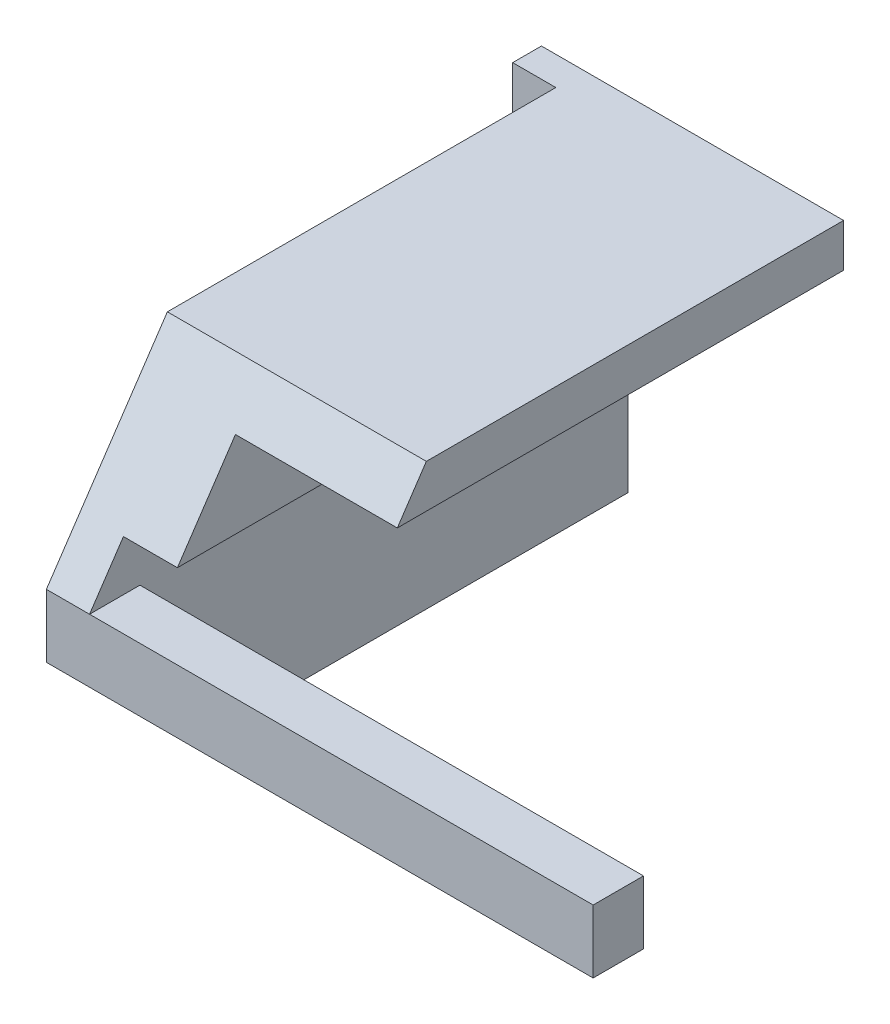
ISO-10303-21;
HEADER;
FILE_DESCRIPTION(('STEP AP214'),'2;1');
FILE_NAME('part.step','',(''),(''),'','','');
FILE_SCHEMA(('AUTOMOTIVE_DESIGN { 1 0 10303 214 1 1 1 1 }'));
ENDSEC;
DATA;
#1=APPLICATION_CONTEXT('core data for automotive mechanical design processes');
#2=APPLICATION_PROTOCOL_DEFINITION('international standard','automotive_design',2000,#1);
#3=PRODUCT_CONTEXT('',#1,'mechanical');
#4=PRODUCT('Part','Part','',(#3));
#5=PRODUCT_RELATED_PRODUCT_CATEGORY('part','',(#4));
#6=PRODUCT_DEFINITION_FORMATION('','',#4);
#7=PRODUCT_DEFINITION_CONTEXT('part definition',#1,'design');
#8=PRODUCT_DEFINITION('design','',#6,#7);
#9=PRODUCT_DEFINITION_SHAPE('','',#8);
#10=(LENGTH_UNIT() NAMED_UNIT(*) SI_UNIT(.MILLI.,.METRE.));
#11=(NAMED_UNIT(*) PLANE_ANGLE_UNIT() SI_UNIT($,.RADIAN.));
#12=(NAMED_UNIT(*) SI_UNIT($,.STERADIAN.) SOLID_ANGLE_UNIT());
#13=UNCERTAINTY_MEASURE_WITH_UNIT(LENGTH_MEASURE(1.E-05),#10,'distance_accuracy_value','');
#14=(GEOMETRIC_REPRESENTATION_CONTEXT(3) GLOBAL_UNCERTAINTY_ASSIGNED_CONTEXT((#13)) GLOBAL_UNIT_ASSIGNED_CONTEXT((#10,
#11,#12)) REPRESENTATION_CONTEXT('',''));
#15=CARTESIAN_POINT('',(0.,0.,0.));
#16=DIRECTION('',(0.,0.,1.));
#17=DIRECTION('',(1.,0.,0.));
#18=AXIS2_PLACEMENT_3D('',#15,#16,#17);
#19=CARTESIAN_POINT('',(3.,0.,0.));
#20=DIRECTION('',(-1.,0.,0.));
#21=DIRECTION('',(0.,0.,1.));
#22=AXIS2_PLACEMENT_3D('',#19,#20,#21);
#23=PLANE('',#22);
#24=DIRECTION('',(0.,0.,1.));
#25=VECTOR('',#24,1.);
#26=CARTESIAN_POINT('',(3.,0.394800000000001,18.2210435524013));
#27=LINE('',#26,#25);
#28=CARTESIAN_POINT('',(3.,0.394799999999999,1.60207145908039));
#29=VERTEX_POINT('',#28);
#30=CARTESIAN_POINT('',(3.,0.394800000000001,20.552934304));
#31=VERTEX_POINT('',#30);
#32=EDGE_CURVE('E177',#29,#31,#27,.T.);
#33=ORIENTED_EDGE('',*,*,#32,.T.);
#34=DIRECTION('',(0.,-0.829790900445012,0.558074422938962));
#35=VECTOR('',#34,1.);
#36=CARTESIAN_POINT('',(3.,9.39479999999999,14.5));
#37=LINE('',#36,#35);
#38=CARTESIAN_POINT('',(3.,-3.1052,22.9068532));
#39=VERTEX_POINT('',#38);
#40=EDGE_CURVE('E179',#31,#39,#37,.T.);
#41=ORIENTED_EDGE('',*,*,#40,.T.);
#42=DIRECTION('',(0.,0.,-1.));
#43=VECTOR('',#42,1.);
#44=CARTESIAN_POINT('',(3.,-3.1052,0.));
#45=LINE('',#44,#43);
#46=CARTESIAN_POINT('',(3.,-3.1052,19.4068532));
#47=VERTEX_POINT('',#46);
#48=EDGE_CURVE('E13',#39,#47,#45,.T.);
#49=ORIENTED_EDGE('',*,*,#48,.T.);
#50=DIRECTION('',(0.,-1.,0.));
#51=VECTOR('',#50,1.);
#52=CARTESIAN_POINT('',(3.,-3.1052,19.4068532));
#53=LINE('',#52,#51);
#54=CARTESIAN_POINT('',(3.,-7.5,19.4068532));
#55=VERTEX_POINT('',#54);
#56=EDGE_CURVE('E220',#47,#55,#53,.T.);
#57=ORIENTED_EDGE('',*,*,#56,.T.);
#58=DIRECTION('',(0.,0.,-1.));
#59=VECTOR('',#58,1.);
#60=CARTESIAN_POINT('',(3.,-7.5,0.));
#61=LINE('',#60,#59);
#62=CARTESIAN_POINT('',(3.,-7.5,22.9068532));
#63=VERTEX_POINT('',#62);
#64=EDGE_CURVE('E214',#63,#55,#61,.T.);
#65=ORIENTED_EDGE('',*,*,#64,.F.);
#66=DIRECTION('',(0.,-0.639876254507868,-0.768477962544783));
#67=VECTOR('',#66,1.);
#68=CARTESIAN_POINT('',(3.,-7.5,22.9068532));
#69=LINE('',#68,#67);
#70=CARTESIAN_POINT('',(3.,-14.5,14.5));
#71=VERTEX_POINT('',#70);
#72=EDGE_CURVE('E57',#63,#71,#69,.T.);
#73=ORIENTED_EDGE('',*,*,#72,.T.);
#74=DIRECTION('',(0.,0.,-1.));
#75=VECTOR('',#74,1.);
#76=CARTESIAN_POINT('',(3.,-14.5,14.5));
#77=LINE('',#76,#75);
#78=CARTESIAN_POINT('',(3.,-14.5,-14.5));
#79=VERTEX_POINT('',#78);
#80=EDGE_CURVE('E265',#71,#79,#77,.T.);
#81=ORIENTED_EDGE('',*,*,#80,.T.);
#82=DIRECTION('',(0.,1.,0.));
#83=VECTOR('',#82,1.);
#84=CARTESIAN_POINT('',(3.,-7.5,-14.5));
#85=LINE('',#84,#83);
#86=CARTESIAN_POINT('',(3.,0.394800000000001,-14.5));
#87=VERTEX_POINT('',#86);
#88=EDGE_CURVE('E267',#79,#87,#85,.T.);
#89=ORIENTED_EDGE('',*,*,#88,.T.);
#90=CARTESIAN_POINT('',(3.,0.394799999999998,-1.60207145908039));
#91=VERTEX_POINT('',#90);
#92=EDGE_CURVE('E187',#87,#91,#27,.T.);
#93=ORIENTED_EDGE('',*,*,#92,.T.);
#94=CARTESIAN_POINT('',(3.,0.,0.));
#95=DIRECTION('',(-1.,0.,0.));
#96=DIRECTION('',(0.,0.,1.));
#97=AXIS2_PLACEMENT_3D('',#94,#95,#96);
#98=CIRCLE('',#97,1.64999999999999);
#99=EDGE_CURVE('E183',#29,#91,#98,.F.);
#100=ORIENTED_EDGE('',*,*,#99,.F.);
#101=EDGE_LOOP('',(#33,#41,#49,#57,#65,#73,#81,#89,#93,#100));
#102=FACE_BOUND('',#101,.T.);
#103=ADVANCED_FACE('F42',(#102),#23,.F.);
#104=CARTESIAN_POINT('',(0.,0.,19.4068532));
#105=DIRECTION('',(0.,0.,-1.));
#106=DIRECTION('',(-1.,0.,0.));
#107=AXIS2_PLACEMENT_3D('',#104,#105,#106);
#108=PLANE('',#107);
#109=DIRECTION('',(1.,0.,0.));
#110=VECTOR('',#109,1.);
#111=CARTESIAN_POINT('',(0.,-7.5,19.4068532));
#112=LINE('',#111,#110);
#113=CARTESIAN_POINT('',(38.,-7.5,19.4068532));
#114=VERTEX_POINT('',#113);
#115=EDGE_CURVE('E50',#55,#114,#112,.T.);
#116=ORIENTED_EDGE('',*,*,#115,.F.);
#117=ORIENTED_EDGE('',*,*,#56,.F.);
#118=DIRECTION('',(-1.,0.,0.));
#119=VECTOR('',#118,1.);
#120=CARTESIAN_POINT('',(0.,-3.1052,19.4068532));
#121=LINE('',#120,#119);
#122=CARTESIAN_POINT('',(38.,-3.1052,19.4068532));
#123=VERTEX_POINT('',#122);
#124=EDGE_CURVE('E65',#123,#47,#121,.T.);
#125=ORIENTED_EDGE('',*,*,#124,.F.);
#126=DIRECTION('',(0.,1.,0.));
#127=VECTOR('',#126,1.);
#128=CARTESIAN_POINT('',(38.,-7.5,19.4068532));
#129=LINE('',#128,#127);
#130=EDGE_CURVE('E269',#114,#123,#129,.T.);
#131=ORIENTED_EDGE('',*,*,#130,.F.);
#132=EDGE_LOOP('',(#116,#117,#125,#131));
#133=FACE_BOUND('',#132,.T.);
#134=ADVANCED_FACE('F333',(#133),#108,.T.);
#135=CARTESIAN_POINT('',(38.,0.,0.));
#136=DIRECTION('',(1.,0.,0.));
#137=DIRECTION('',(0.,0.,-1.));
#138=AXIS2_PLACEMENT_3D('',#135,#136,#137);
#139=PLANE('',#138);
#140=ORIENTED_EDGE('',*,*,#130,.T.);
#141=DIRECTION('',(0.,0.,-1.));
#142=VECTOR('',#141,1.);
#143=CARTESIAN_POINT('',(38.,-3.1052,0.));
#144=LINE('',#143,#142);
#145=CARTESIAN_POINT('',(38.,-3.1052,22.9068532));
#146=VERTEX_POINT('',#145);
#147=EDGE_CURVE('E225',#146,#123,#144,.T.);
#148=ORIENTED_EDGE('',*,*,#147,.F.);
#149=DIRECTION('',(0.,1.,0.));
#150=VECTOR('',#149,1.);
#151=CARTESIAN_POINT('',(38.,-7.5,22.9068532));
#152=LINE('',#151,#150);
#153=CARTESIAN_POINT('',(38.,-7.5,22.9068532));
#154=VERTEX_POINT('',#153);
#155=EDGE_CURVE('E228',#154,#146,#152,.T.);
#156=ORIENTED_EDGE('',*,*,#155,.F.);
#157=DIRECTION('',(0.,0.,-1.));
#158=VECTOR('',#157,1.);
#159=CARTESIAN_POINT('',(38.,-7.5,19.4068532));
#160=LINE('',#159,#158);
#161=EDGE_CURVE('E272',#154,#114,#160,.T.);
#162=ORIENTED_EDGE('',*,*,#161,.T.);
#163=EDGE_LOOP('',(#140,#148,#156,#162));
#164=FACE_BOUND('',#163,.T.);
#165=ADVANCED_FACE('F336',(#164),#139,.T.);
#166=CARTESIAN_POINT('',(0.,0.,22.9068532));
#167=DIRECTION('',(0.,0.,-1.));
#168=DIRECTION('',(-1.,0.,0.));
#169=AXIS2_PLACEMENT_3D('',#166,#167,#168);
#170=PLANE('',#169);
#171=DIRECTION('',(1.,0.,0.));
#172=VECTOR('',#171,1.);
#173=CARTESIAN_POINT('',(0.,-3.1052,22.9068532));
#174=LINE('',#173,#172);
#175=EDGE_CURVE('E223',#39,#146,#174,.T.);
#176=ORIENTED_EDGE('',*,*,#175,.F.);
#177=CARTESIAN_POINT('',(0.,-3.1052,22.9068532));
#178=VERTEX_POINT('',#177);
#179=EDGE_CURVE('E198',#178,#39,#174,.T.);
#180=ORIENTED_EDGE('',*,*,#179,.F.);
#181=DIRECTION('',(0.,-1.,0.));
#182=VECTOR('',#181,1.);
#183=CARTESIAN_POINT('',(0.,0.394800000000002,22.9068532));
#184=LINE('',#183,#182);
#185=CARTESIAN_POINT('',(0.,-7.5,22.9068532));
#186=VERTEX_POINT('',#185);
#187=EDGE_CURVE('E231',#178,#186,#184,.T.);
#188=ORIENTED_EDGE('',*,*,#187,.T.);
#189=DIRECTION('',(1.,0.,0.));
#190=VECTOR('',#189,1.);
#191=CARTESIAN_POINT('',(0.,-7.5,22.9068532));
#192=LINE('',#191,#190);
#193=EDGE_CURVE('E232',#186,#63,#192,.T.);
#194=ORIENTED_EDGE('',*,*,#193,.T.);
#195=EDGE_CURVE('E235',#63,#154,#192,.T.);
#196=ORIENTED_EDGE('',*,*,#195,.T.);
#197=ORIENTED_EDGE('',*,*,#155,.T.);
#198=EDGE_LOOP('',(#176,#180,#188,#194,#196,#197));
#199=FACE_BOUND('',#198,.T.);
#200=ADVANCED_FACE('F339',(#199),#170,.F.);
#201=CARTESIAN_POINT('',(0.,0.,0.));
#202=DIRECTION('',(-1.,0.,0.));
#203=DIRECTION('',(0.,0.,1.));
#204=AXIS2_PLACEMENT_3D('',#201,#202,#203);
#205=PLANE('',#204);
#206=DIRECTION('',(0.,-0.829790900445012,0.558074422938962));
#207=VECTOR('',#206,1.);
#208=CARTESIAN_POINT('',(0.,9.39479999999999,14.5));
#209=LINE('',#208,#207);
#210=CARTESIAN_POINT('',(0.,9.3948,14.5));
#211=VERTEX_POINT('',#210);
#212=EDGE_CURVE('E212',#211,#178,#209,.T.);
#213=ORIENTED_EDGE('',*,*,#212,.F.);
#214=DIRECTION('',(0.,0.,1.));
#215=VECTOR('',#214,1.);
#216=CARTESIAN_POINT('',(0.,9.39479999999999,-12.5));
#217=LINE('',#216,#215);
#218=CARTESIAN_POINT('',(0.,9.39479999999999,-12.5));
#219=VERTEX_POINT('',#218);
#220=EDGE_CURVE('E253',#219,#211,#217,.T.);
#221=ORIENTED_EDGE('',*,*,#220,.F.);
#222=DIRECTION('',(0.,-1.,0.));
#223=VECTOR('',#222,1.);
#224=CARTESIAN_POINT('',(0.,12.5,-12.5));
#225=LINE('',#224,#223);
#226=CARTESIAN_POINT('',(0.,-11.5,-12.5));
#227=VERTEX_POINT('',#226);
#228=EDGE_CURVE('E311',#219,#227,#225,.T.);
#229=ORIENTED_EDGE('',*,*,#228,.T.);
#230=CARTESIAN_POINT('',(0.,-12.5,-12.5));
#231=DIRECTION('',(-1.,0.,0.));
#232=DIRECTION('',(0.,0.,1.));
#233=AXIS2_PLACEMENT_3D('',#230,#231,#232);
#234=CIRCLE('',#233,0.999999999999999);
#235=CARTESIAN_POINT('',(0.,-12.5,-11.5));
#236=VERTEX_POINT('',#235);
#237=EDGE_CURVE('E301',#236,#227,#234,.F.);
#238=ORIENTED_EDGE('',*,*,#237,.F.);
#239=DIRECTION('',(0.,0.,1.));
#240=VECTOR('',#239,1.);
#241=CARTESIAN_POINT('',(0.,-12.5,12.5));
#242=LINE('',#241,#240);
#243=CARTESIAN_POINT('',(0.,-12.5,14.5));
#244=VERTEX_POINT('',#243);
#245=EDGE_CURVE('E313',#236,#244,#242,.T.);
#246=ORIENTED_EDGE('',*,*,#245,.T.);
#247=DIRECTION('',(0.,1.,0.));
#248=VECTOR('',#247,1.);
#249=CARTESIAN_POINT('',(0.,9.39479999999999,14.5));
#250=LINE('',#249,#248);
#251=CARTESIAN_POINT('',(0.,-14.5,14.5));
#252=VERTEX_POINT('',#251);
#253=EDGE_CURVE('E215',#252,#244,#250,.T.);
#254=ORIENTED_EDGE('',*,*,#253,.F.);
#255=DIRECTION('',(0.,-0.639876254507868,-0.768477962544784));
#256=VECTOR('',#255,1.);
#257=CARTESIAN_POINT('',(0.,-7.5,22.9068532));
#258=LINE('',#257,#256);
#259=EDGE_CURVE('E210',#186,#252,#258,.T.);
#260=ORIENTED_EDGE('',*,*,#259,.F.);
#261=ORIENTED_EDGE('',*,*,#187,.F.);
#262=EDGE_LOOP('',(#213,#221,#229,#238,#246,#254,#260,#261));
#263=FACE_BOUND('',#262,.T.);
#264=CARTESIAN_POINT('',(0.,0.,0.));
#265=DIRECTION('',(-1.,0.,0.));
#266=DIRECTION('',(0.,0.,1.));
#267=AXIS2_PLACEMENT_3D('',#264,#265,#266);
#268=CIRCLE('',#267,1.64999999999999);
#269=CARTESIAN_POINT('',(0.,0.,1.64999999999999));
#270=VERTEX_POINT('',#269);
#271=EDGE_CURVE('E289',#270,#270,#268,.T.);
#272=ORIENTED_EDGE('',*,*,#271,.F.);
#273=EDGE_LOOP('',(#272));
#274=FACE_BOUND('',#273,.T.);
#275=ADVANCED_FACE('F431',(#263,#274),#205,.T.);
#276=CARTESIAN_POINT('',(6.75000001549883,0.,0.));
#277=DIRECTION('',(1.,0.,0.));
#278=DIRECTION('',(0.,0.,-1.));
#279=AXIS2_PLACEMENT_3D('',#276,#277,#278);
#280=PLANE('',#279);
#281=DIRECTION('',(0.,0.,1.));
#282=VECTOR('',#281,1.);
#283=CARTESIAN_POINT('',(6.75000001549883,6.3948,-14.5));
#284=LINE('',#283,#282);
#285=CARTESIAN_POINT('',(6.75000001549883,6.3948,-14.5));
#286=VERTEX_POINT('',#285);
#287=CARTESIAN_POINT('',(6.75000001549883,6.3948,16.517644768));
#288=VERTEX_POINT('',#287);
#289=EDGE_CURVE('E263',#286,#288,#284,.T.);
#290=ORIENTED_EDGE('',*,*,#289,.T.);
#291=DIRECTION('',(0.,0.829790900445012,-0.558074422938962));
#292=VECTOR('',#291,1.);
#293=CARTESIAN_POINT('',(6.75000001549883,-7.1351861128365,25.6172133318924));
#294=LINE('',#293,#292);
#295=CARTESIAN_POINT('',(6.75000001549883,0.3948,20.552934304));
#296=VERTEX_POINT('',#295);
#297=EDGE_CURVE('E204',#296,#288,#294,.T.);
#298=ORIENTED_EDGE('',*,*,#297,.F.);
#299=DIRECTION('',(0.,0.,-1.));
#300=VECTOR('',#299,1.);
#301=CARTESIAN_POINT('',(6.75000001549883,0.394800000000001,18.2210435524013));
#302=LINE('',#301,#300);
#303=CARTESIAN_POINT('',(6.75000001549883,0.394799999999996,-14.5));
#304=VERTEX_POINT('',#303);
#305=EDGE_CURVE('E188',#296,#304,#302,.T.);
#306=ORIENTED_EDGE('',*,*,#305,.T.);
#307=DIRECTION('',(0.,1.,0.));
#308=VECTOR('',#307,1.);
#309=CARTESIAN_POINT('',(6.75000001549883,-7.5,-14.5));
#310=LINE('',#309,#308);
#311=EDGE_CURVE('E252',#304,#286,#310,.T.);
#312=ORIENTED_EDGE('',*,*,#311,.T.);
#313=EDGE_LOOP('',(#290,#298,#306,#312));
#314=FACE_BOUND('',#313,.T.);
#315=ADVANCED_FACE('F386',(#314),#280,.T.);
#316=CARTESIAN_POINT('',(0.,0.394799999999999,0.));
#317=DIRECTION('',(0.,-1.,0.));
#318=DIRECTION('',(0.,0.,-1.));
#319=AXIS2_PLACEMENT_3D('',#316,#317,#318);
#320=PLANE('',#319);
#321=ORIENTED_EDGE('',*,*,#305,.F.);
#322=DIRECTION('',(1.,0.,0.));
#323=VECTOR('',#322,1.);
#324=CARTESIAN_POINT('',(3.,0.394800000000001,20.552934304));
#325=LINE('',#324,#323);
#326=EDGE_CURVE('E196',#31,#296,#325,.T.);
#327=ORIENTED_EDGE('',*,*,#326,.F.);
#328=ORIENTED_EDGE('',*,*,#32,.F.);
#329=DIRECTION('',(-1.,0.,0.));
#330=VECTOR('',#329,1.);
#331=CARTESIAN_POINT('',(0.,0.394799999999999,1.60207145908039));
#332=LINE('',#331,#330);
#333=CARTESIAN_POINT('',(5.,0.394799999999999,1.60207145908039));
#334=VERTEX_POINT('',#333);
#335=EDGE_CURVE('E246',#29,#334,#332,.F.);
#336=ORIENTED_EDGE('',*,*,#335,.T.);
#337=DIRECTION('',(0.,0.,-1.));
#338=VECTOR('',#337,1.);
#339=CARTESIAN_POINT('',(5.,0.394799999999999,0.));
#340=LINE('',#339,#338);
#341=CARTESIAN_POINT('',(5.,0.394799999999999,-1.60207145908039));
#342=VERTEX_POINT('',#341);
#343=EDGE_CURVE('E242',#334,#342,#340,.T.);
#344=ORIENTED_EDGE('',*,*,#343,.T.);
#345=DIRECTION('',(-1.,0.,0.));
#346=VECTOR('',#345,1.);
#347=CARTESIAN_POINT('',(0.,0.394799999999999,-1.60207145908039));
#348=LINE('',#347,#346);
#349=EDGE_CURVE('E244',#342,#91,#348,.T.);
#350=ORIENTED_EDGE('',*,*,#349,.T.);
#351=ORIENTED_EDGE('',*,*,#92,.F.);
#352=DIRECTION('',(-1.,0.,0.));
#353=VECTOR('',#352,1.);
#354=CARTESIAN_POINT('',(3.,0.394800000000001,-14.5));
#355=LINE('',#354,#353);
#356=EDGE_CURVE('E239',#304,#87,#355,.T.);
#357=ORIENTED_EDGE('',*,*,#356,.F.);
#358=EDGE_LOOP('',(#321,#327,#328,#336,#344,#350,#351,#357));
#359=FACE_BOUND('',#358,.T.);
#360=ADVANCED_FACE('F201',(#359),#320,.T.);
#361=CARTESIAN_POINT('',(-3.,14.5,14.5));
#362=DIRECTION('',(0.,0.,1.));
#363=DIRECTION('',(0.,-1.,0.));
#364=AXIS2_PLACEMENT_3D('',#361,#362,#363);
#365=PLANE('',#364);
#366=ORIENTED_EDGE('',*,*,#253,.T.);
#367=DIRECTION('',(-1.,0.,0.));
#368=VECTOR('',#367,1.);
#369=CARTESIAN_POINT('',(5.,-12.5,14.5));
#370=LINE('',#369,#368);
#371=CARTESIAN_POINT('',(-3.,-12.5,14.5));
#372=VERTEX_POINT('',#371);
#373=EDGE_CURVE('E295',#244,#372,#370,.T.);
#374=ORIENTED_EDGE('',*,*,#373,.T.);
#375=DIRECTION('',(0.,-1.,0.));
#376=VECTOR('',#375,1.);
#377=CARTESIAN_POINT('',(-3.,14.5,14.5));
#378=LINE('',#377,#376);
#379=CARTESIAN_POINT('',(-3.,-14.5,14.5));
#380=VERTEX_POINT('',#379);
#381=EDGE_CURVE('E323',#372,#380,#378,.T.);
#382=ORIENTED_EDGE('',*,*,#381,.T.);
#383=DIRECTION('',(-1.,0.,0.));
#384=VECTOR('',#383,1.);
#385=CARTESIAN_POINT('',(10.,-14.5,14.5));
#386=LINE('',#385,#384);
#387=EDGE_CURVE('E286',#252,#380,#386,.T.);
#388=ORIENTED_EDGE('',*,*,#387,.F.);
#389=EDGE_LOOP('',(#366,#374,#382,#388));
#390=FACE_BOUND('',#389,.T.);
#391=ADVANCED_FACE('F345',(#390),#365,.T.);
#392=CARTESIAN_POINT('',(0.,6.3948,0.));
#393=DIRECTION('',(0.,-1.,0.));
#394=DIRECTION('',(0.,0.,-1.));
#395=AXIS2_PLACEMENT_3D('',#392,#393,#394);
#396=PLANE('',#395);
#397=DIRECTION('',(0.,0.,-1.));
#398=VECTOR('',#397,1.);
#399=CARTESIAN_POINT('',(18.,6.3948,17.5));
#400=LINE('',#399,#398);
#401=CARTESIAN_POINT('',(18.,6.3948,16.517644768));
#402=VERTEX_POINT('',#401);
#403=CARTESIAN_POINT('',(18.,6.3948,-14.5));
#404=VERTEX_POINT('',#403);
#405=EDGE_CURVE('E274',#402,#404,#400,.T.);
#406=ORIENTED_EDGE('',*,*,#405,.F.);
#407=DIRECTION('',(1.,0.,0.));
#408=VECTOR('',#407,1.);
#409=CARTESIAN_POINT('',(6.75000001549883,6.3948,16.517644768));
#410=LINE('',#409,#408);
#411=EDGE_CURVE('E206',#288,#402,#410,.T.);
#412=ORIENTED_EDGE('',*,*,#411,.F.);
#413=ORIENTED_EDGE('',*,*,#289,.F.);
#414=DIRECTION('',(1.,0.,0.));
#415=VECTOR('',#414,1.);
#416=CARTESIAN_POINT('',(33.,6.3948,-14.5));
#417=LINE('',#416,#415);
#418=EDGE_CURVE('E279',#286,#404,#417,.T.);
#419=ORIENTED_EDGE('',*,*,#418,.T.);
#420=EDGE_LOOP('',(#406,#412,#413,#419));
#421=FACE_BOUND('',#420,.T.);
#422=ADVANCED_FACE('F396',(#421),#396,.T.);
#423=CARTESIAN_POINT('',(18.,0.,0.));
#424=DIRECTION('',(1.,0.,0.));
#425=DIRECTION('',(0.,0.,-1.));
#426=AXIS2_PLACEMENT_3D('',#423,#424,#425);
#427=PLANE('',#426);
#428=DIRECTION('',(0.,0.,-1.));
#429=VECTOR('',#428,1.);
#430=CARTESIAN_POINT('',(18.,9.39479999999999,19.4068532));
#431=LINE('',#430,#429);
#432=CARTESIAN_POINT('',(18.,9.39479999999999,14.5));
#433=VERTEX_POINT('',#432);
#434=CARTESIAN_POINT('',(18.,9.39479999999999,-14.5));
#435=VERTEX_POINT('',#434);
#436=EDGE_CURVE('E249',#433,#435,#431,.T.);
#437=ORIENTED_EDGE('',*,*,#436,.F.);
#438=DIRECTION('',(0.,0.829790900445012,-0.558074422938962));
#439=VECTOR('',#438,1.);
#440=CARTESIAN_POINT('',(18.,-3.00386848206844,22.8387028643373));
#441=LINE('',#440,#439);
#442=EDGE_CURVE('E199',#402,#433,#441,.T.);
#443=ORIENTED_EDGE('',*,*,#442,.F.);
#444=ORIENTED_EDGE('',*,*,#405,.T.);
#445=DIRECTION('',(0.,1.,0.));
#446=VECTOR('',#445,1.);
#447=CARTESIAN_POINT('',(18.,6.3948,-14.5));
#448=LINE('',#447,#446);
#449=EDGE_CURVE('E276',#404,#435,#448,.T.);
#450=ORIENTED_EDGE('',*,*,#449,.T.);
#451=EDGE_LOOP('',(#437,#443,#444,#450));
#452=FACE_BOUND('',#451,.T.);
#453=ADVANCED_FACE('F394',(#452),#427,.T.);
#454=CARTESIAN_POINT('',(0.,9.3948,0.));
#455=DIRECTION('',(0.,-1.,0.));
#456=DIRECTION('',(0.,0.,-1.));
#457=AXIS2_PLACEMENT_3D('',#454,#455,#456);
#458=PLANE('',#457);
#459=DIRECTION('',(1.,0.,0.));
#460=VECTOR('',#459,1.);
#461=CARTESIAN_POINT('',(0.,9.39479999999999,14.5));
#462=LINE('',#461,#460);
#463=EDGE_CURVE('E250',#211,#433,#462,.T.);
#464=ORIENTED_EDGE('',*,*,#463,.T.);
#465=ORIENTED_EDGE('',*,*,#436,.T.);
#466=DIRECTION('',(-1.,0.,0.));
#467=VECTOR('',#466,1.);
#468=CARTESIAN_POINT('',(18.,9.39479999999999,-14.5));
#469=LINE('',#468,#467);
#470=CARTESIAN_POINT('',(-3.,9.39479999999999,-14.5));
#471=VERTEX_POINT('',#470);
#472=EDGE_CURVE('E259',#435,#471,#469,.T.);
#473=ORIENTED_EDGE('',*,*,#472,.T.);
#474=DIRECTION('',(0.,0.,1.));
#475=VECTOR('',#474,1.);
#476=CARTESIAN_POINT('',(-3.,9.39479999999999,-14.5));
#477=LINE('',#476,#475);
#478=CARTESIAN_POINT('',(-3.,9.39479999999999,-12.5));
#479=VERTEX_POINT('',#478);
#480=EDGE_CURVE('E257',#471,#479,#477,.T.);
#481=ORIENTED_EDGE('',*,*,#480,.T.);
#482=DIRECTION('',(1.,0.,0.));
#483=VECTOR('',#482,1.);
#484=CARTESIAN_POINT('',(-3.,9.39479999999999,-12.5));
#485=LINE('',#484,#483);
#486=EDGE_CURVE('E255',#479,#219,#485,.T.);
#487=ORIENTED_EDGE('',*,*,#486,.T.);
#488=ORIENTED_EDGE('',*,*,#220,.T.);
#489=EDGE_LOOP('',(#464,#465,#473,#481,#487,#488));
#490=FACE_BOUND('',#489,.T.);
#491=ADVANCED_FACE('F371',(#490),#458,.F.);
#492=CARTESIAN_POINT('',(0.,0.,0.));
#493=DIRECTION('',(-1.,0.,0.));
#494=DIRECTION('',(0.,0.,1.));
#495=AXIS2_PLACEMENT_3D('',#492,#493,#494);
#496=CYLINDRICAL_SURFACE('',#495,1.64999999999999);
#497=ORIENTED_EDGE('',*,*,#271,.T.);
#498=EDGE_LOOP('',(#497));
#499=FACE_BOUND('',#498,.T.);
#500=ORIENTED_EDGE('',*,*,#335,.F.);
#501=ORIENTED_EDGE('',*,*,#99,.T.);
#502=ORIENTED_EDGE('',*,*,#349,.F.);
#503=CARTESIAN_POINT('',(5.,0.,0.));
#504=DIRECTION('',(1.,0.,0.));
#505=DIRECTION('',(0.,0.,-1.));
#506=AXIS2_PLACEMENT_3D('',#503,#504,#505);
#507=CIRCLE('',#506,1.64999999999999);
#508=EDGE_CURVE('E282',#342,#334,#507,.T.);
#509=ORIENTED_EDGE('',*,*,#508,.T.);
#510=EDGE_LOOP('',(#500,#501,#502,#509));
#511=FACE_BOUND('',#510,.T.);
#512=ADVANCED_FACE('F359',(#499,#511),#496,.F.);
#513=CARTESIAN_POINT('',(5.,0.,0.));
#514=DIRECTION('',(1.,0.,0.));
#515=DIRECTION('',(0.,0.,-1.));
#516=AXIS2_PLACEMENT_3D('',#513,#514,#515);
#517=PLANE('',#516);
#518=ORIENTED_EDGE('',*,*,#343,.F.);
#519=ORIENTED_EDGE('',*,*,#508,.F.);
#520=EDGE_LOOP('',(#518,#519));
#521=FACE_BOUND('',#520,.T.);
#522=ADVANCED_FACE('F363',(#521),#517,.F.);
#523=CARTESIAN_POINT('',(-3.,-14.5,-14.5));
#524=DIRECTION('',(0.,0.,-1.));
#525=DIRECTION('',(0.,1.,0.));
#526=AXIS2_PLACEMENT_3D('',#523,#524,#525);
#527=PLANE('',#526);
#528=ORIENTED_EDGE('',*,*,#356,.T.);
#529=ORIENTED_EDGE('',*,*,#88,.F.);
#530=DIRECTION('',(-1.,0.,0.));
#531=VECTOR('',#530,1.);
#532=CARTESIAN_POINT('',(10.,-14.5,-14.5));
#533=LINE('',#532,#531);
#534=CARTESIAN_POINT('',(-3.,-14.5,-14.5));
#535=VERTEX_POINT('',#534);
#536=EDGE_CURVE('E287',#79,#535,#533,.T.);
#537=ORIENTED_EDGE('',*,*,#536,.T.);
#538=DIRECTION('',(0.,1.,0.));
#539=VECTOR('',#538,1.);
#540=CARTESIAN_POINT('',(-3.,-14.5,-14.5));
#541=LINE('',#540,#539);
#542=EDGE_CURVE('E317',#535,#471,#541,.T.);
#543=ORIENTED_EDGE('',*,*,#542,.T.);
#544=ORIENTED_EDGE('',*,*,#472,.F.);
#545=ORIENTED_EDGE('',*,*,#449,.F.);
#546=ORIENTED_EDGE('',*,*,#418,.F.);
#547=ORIENTED_EDGE('',*,*,#311,.F.);
#548=EDGE_LOOP('',(#528,#529,#537,#543,#544,#545,#546,#547));
#549=FACE_BOUND('',#548,.T.);
#550=ADVANCED_FACE('F44',(#549),#527,.T.);
#551=CARTESIAN_POINT('',(10.,-14.5,14.5));
#552=DIRECTION('',(0.,1.,0.));
#553=DIRECTION('',(0.,0.,1.));
#554=AXIS2_PLACEMENT_3D('',#551,#552,#553);
#555=PLANE('',#554);
#556=ORIENTED_EDGE('',*,*,#536,.F.);
#557=ORIENTED_EDGE('',*,*,#80,.F.);
#558=EDGE_CURVE('E290',#71,#252,#386,.T.);
#559=ORIENTED_EDGE('',*,*,#558,.T.);
#560=ORIENTED_EDGE('',*,*,#387,.T.);
#561=DIRECTION('',(0.,0.,-1.));
#562=VECTOR('',#561,1.);
#563=CARTESIAN_POINT('',(-3.,-14.5,14.5));
#564=LINE('',#563,#562);
#565=EDGE_CURVE('E283',#380,#535,#564,.T.);
#566=ORIENTED_EDGE('',*,*,#565,.T.);
#567=EDGE_LOOP('',(#556,#557,#559,#560,#566));
#568=FACE_BOUND('',#567,.T.);
#569=ADVANCED_FACE('F351',(#568),#555,.F.);
#570=CARTESIAN_POINT('',(0.,-12.5,12.5));
#571=DIRECTION('',(0.,-1.,0.));
#572=DIRECTION('',(0.,0.,-1.));
#573=AXIS2_PLACEMENT_3D('',#570,#571,#572);
#574=PLANE('',#573);
#575=ORIENTED_EDGE('',*,*,#373,.F.);
#576=ORIENTED_EDGE('',*,*,#245,.F.);
#577=DIRECTION('',(-1.,0.,0.));
#578=VECTOR('',#577,1.);
#579=CARTESIAN_POINT('',(2.82842712474619,-12.5,-11.5));
#580=LINE('',#579,#578);
#581=CARTESIAN_POINT('',(-3.,-12.5,-11.5));
#582=VERTEX_POINT('',#581);
#583=EDGE_CURVE('E307',#236,#582,#580,.T.);
#584=ORIENTED_EDGE('',*,*,#583,.T.);
#585=DIRECTION('',(0.,0.,1.));
#586=VECTOR('',#585,1.);
#587=CARTESIAN_POINT('',(-3.,-12.5,12.5));
#588=LINE('',#587,#586);
#589=EDGE_CURVE('E314',#582,#372,#588,.T.);
#590=ORIENTED_EDGE('',*,*,#589,.T.);
#591=EDGE_LOOP('',(#575,#576,#584,#590));
#592=FACE_BOUND('',#591,.T.);
#593=ADVANCED_FACE('F436',(#592),#574,.F.);
#594=CARTESIAN_POINT('',(-3.,0.,0.));
#595=DIRECTION('',(1.,0.,0.));
#596=DIRECTION('',(0.,0.,-1.));
#597=AXIS2_PLACEMENT_3D('',#594,#595,#596);
#598=PLANE('',#597);
#599=DIRECTION('',(0.,-1.,0.));
#600=VECTOR('',#599,1.);
#601=CARTESIAN_POINT('',(-3.,12.5,-12.5));
#602=LINE('',#601,#600);
#603=CARTESIAN_POINT('',(-3.,-11.5,-12.5));
#604=VERTEX_POINT('',#603);
#605=EDGE_CURVE('E310',#479,#604,#602,.T.);
#606=ORIENTED_EDGE('',*,*,#605,.F.);
#607=ORIENTED_EDGE('',*,*,#480,.F.);
#608=ORIENTED_EDGE('',*,*,#542,.F.);
#609=ORIENTED_EDGE('',*,*,#565,.F.);
#610=ORIENTED_EDGE('',*,*,#381,.F.);
#611=ORIENTED_EDGE('',*,*,#589,.F.);
#612=CARTESIAN_POINT('',(-3.,-12.5,-12.5));
#613=DIRECTION('',(-1.,0.,0.));
#614=DIRECTION('',(0.,0.,1.));
#615=AXIS2_PLACEMENT_3D('',#612,#613,#614);
#616=CIRCLE('',#615,0.999999999999999);
#617=EDGE_CURVE('E299',#604,#582,#616,.T.);
#618=ORIENTED_EDGE('',*,*,#617,.F.);
#619=EDGE_LOOP('',(#606,#607,#608,#609,#610,#611,#618));
#620=FACE_BOUND('',#619,.T.);
#621=ADVANCED_FACE('F420',(#620),#598,.F.);
#622=CARTESIAN_POINT('',(0.,12.5,-12.5));
#623=DIRECTION('',(0.,0.,-1.));
#624=DIRECTION('',(0.,1.,0.));
#625=AXIS2_PLACEMENT_3D('',#622,#623,#624);
#626=PLANE('',#625);
#627=ORIENTED_EDGE('',*,*,#228,.F.);
#628=ORIENTED_EDGE('',*,*,#486,.F.);
#629=ORIENTED_EDGE('',*,*,#605,.T.);
#630=DIRECTION('',(-1.,0.,0.));
#631=VECTOR('',#630,1.);
#632=CARTESIAN_POINT('',(2.82842712474619,-11.5,-12.5));
#633=LINE('',#632,#631);
#634=EDGE_CURVE('E304',#604,#227,#633,.F.);
#635=ORIENTED_EDGE('',*,*,#634,.T.);
#636=EDGE_LOOP('',(#627,#628,#629,#635));
#637=FACE_BOUND('',#636,.T.);
#638=ADVANCED_FACE('F426',(#637),#626,.F.);
#639=CARTESIAN_POINT('',(2.82842712474619,-12.5,-12.5));
#640=DIRECTION('',(-1.,0.,0.));
#641=DIRECTION('',(0.,0.,1.));
#642=AXIS2_PLACEMENT_3D('',#639,#640,#641);
#643=CYLINDRICAL_SURFACE('',#642,0.999999999999999);
#644=ORIENTED_EDGE('',*,*,#237,.T.);
#645=ORIENTED_EDGE('',*,*,#634,.F.);
#646=ORIENTED_EDGE('',*,*,#617,.T.);
#647=ORIENTED_EDGE('',*,*,#583,.F.);
#648=EDGE_LOOP('',(#644,#645,#646,#647));
#649=FACE_BOUND('',#648,.T.);
#650=ADVANCED_FACE('F392',(#649),#643,.F.);
#651=CARTESIAN_POINT('',(0.,-7.5,0.));
#652=DIRECTION('',(0.,1.,0.));
#653=DIRECTION('',(0.,0.,1.));
#654=AXIS2_PLACEMENT_3D('',#651,#652,#653);
#655=PLANE('',#654);
#656=ORIENTED_EDGE('',*,*,#195,.F.);
#657=ORIENTED_EDGE('',*,*,#64,.T.);
#658=ORIENTED_EDGE('',*,*,#115,.T.);
#659=ORIENTED_EDGE('',*,*,#161,.F.);
#660=EDGE_LOOP('',(#656,#657,#658,#659));
#661=FACE_BOUND('',#660,.T.);
#662=ADVANCED_FACE('F331',(#661),#655,.F.);
#663=CARTESIAN_POINT('',(0.,-3.1052,0.));
#664=DIRECTION('',(0.,1.,0.));
#665=DIRECTION('',(0.,0.,1.));
#666=AXIS2_PLACEMENT_3D('',#663,#664,#665);
#667=PLANE('',#666);
#668=ORIENTED_EDGE('',*,*,#48,.F.);
#669=ORIENTED_EDGE('',*,*,#175,.T.);
#670=ORIENTED_EDGE('',*,*,#147,.T.);
#671=ORIENTED_EDGE('',*,*,#124,.T.);
#672=EDGE_LOOP('',(#668,#669,#670,#671));
#673=FACE_BOUND('',#672,.T.);
#674=ADVANCED_FACE('F391',(#673),#667,.T.);
#675=CARTESIAN_POINT('',(-25.3305477194306,9.39479999999999,14.5));
#676=DIRECTION('',(0.,0.558074422938962,0.829790900445012));
#677=DIRECTION('',(0.,-0.829790900445012,0.558074422938962));
#678=AXIS2_PLACEMENT_3D('',#675,#676,#677);
#679=PLANE('',#678);
#680=ORIENTED_EDGE('',*,*,#463,.F.);
#681=ORIENTED_EDGE('',*,*,#212,.T.);
#682=ORIENTED_EDGE('',*,*,#179,.T.);
#683=ORIENTED_EDGE('',*,*,#40,.F.);
#684=ORIENTED_EDGE('',*,*,#326,.T.);
#685=ORIENTED_EDGE('',*,*,#297,.T.);
#686=ORIENTED_EDGE('',*,*,#411,.T.);
#687=ORIENTED_EDGE('',*,*,#442,.T.);
#688=EDGE_LOOP('',(#680,#681,#682,#683,#684,#685,#686,#687));
#689=FACE_BOUND('',#688,.T.);
#690=ADVANCED_FACE('F194',(#689),#679,.T.);
#691=CARTESIAN_POINT('',(-25.3305477194306,-7.5,22.9068532));
#692=DIRECTION('',(0.,-0.768477962544784,0.639876254507868));
#693=DIRECTION('',(0.,-0.639876254507868,-0.768477962544784));
#694=AXIS2_PLACEMENT_3D('',#691,#692,#693);
#695=PLANE('',#694);
#696=ORIENTED_EDGE('',*,*,#193,.F.);
#697=ORIENTED_EDGE('',*,*,#259,.T.);
#698=ORIENTED_EDGE('',*,*,#558,.F.);
#699=ORIENTED_EDGE('',*,*,#72,.F.);
#700=EDGE_LOOP('',(#696,#697,#698,#699));
#701=FACE_BOUND('',#700,.T.);
#702=ADVANCED_FACE('F341',(#701),#695,.T.);
#703=CLOSED_SHELL('',(#103,#134,#165,#200,#275,#315,#360,#391,#422,#453,#491,#512,#522,#550,
#569,#593,#621,#638,#650,#662,#674,#690,#702));
#704=MANIFOLD_SOLID_BREP('B2',#703);
#705=ADVANCED_BREP_SHAPE_REPRESENTATION('',(#18,#704),#14);
#706=SHAPE_DEFINITION_REPRESENTATION(#9,#705);
ENDSEC;
END-ISO-10303-21;
